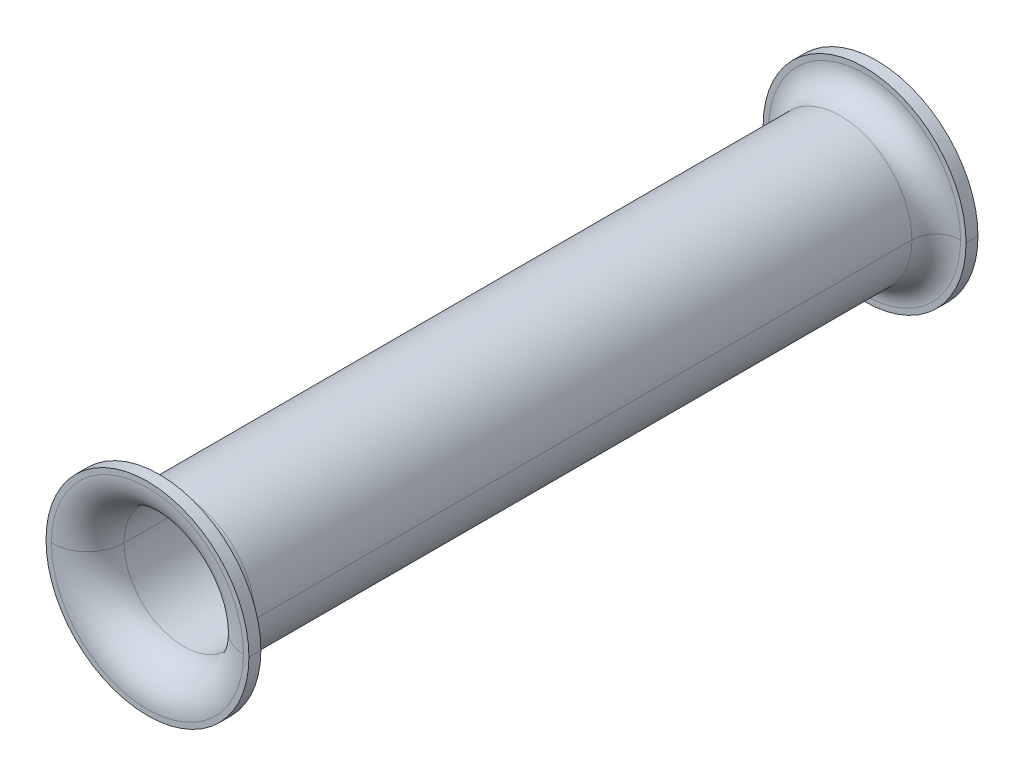
ISO-10303-21;
HEADER;
FILE_DESCRIPTION(('STEP AP214'),'2;1');
FILE_NAME('part.step','',(''),(''),'','','');
FILE_SCHEMA(('AUTOMOTIVE_DESIGN { 1 0 10303 214 1 1 1 1 }'));
ENDSEC;
DATA;
#1=APPLICATION_CONTEXT('core data for automotive mechanical design processes');
#2=APPLICATION_PROTOCOL_DEFINITION('international standard','automotive_design',2000,#1);
#3=PRODUCT_CONTEXT('',#1,'mechanical');
#4=PRODUCT('Part','Part','',(#3));
#5=PRODUCT_RELATED_PRODUCT_CATEGORY('part','',(#4));
#6=PRODUCT_DEFINITION_FORMATION('','',#4);
#7=PRODUCT_DEFINITION_CONTEXT('part definition',#1,'design');
#8=PRODUCT_DEFINITION('design','',#6,#7);
#9=PRODUCT_DEFINITION_SHAPE('','',#8);
#10=(LENGTH_UNIT() NAMED_UNIT(*) SI_UNIT(.MILLI.,.METRE.));
#11=(NAMED_UNIT(*) PLANE_ANGLE_UNIT() SI_UNIT($,.RADIAN.));
#12=(NAMED_UNIT(*) SI_UNIT($,.STERADIAN.) SOLID_ANGLE_UNIT());
#13=UNCERTAINTY_MEASURE_WITH_UNIT(LENGTH_MEASURE(1.E-05),#10,'distance_accuracy_value','');
#14=(GEOMETRIC_REPRESENTATION_CONTEXT(3) GLOBAL_UNCERTAINTY_ASSIGNED_CONTEXT((#13)) GLOBAL_UNIT_ASSIGNED_CONTEXT((#10,
#11,#12)) REPRESENTATION_CONTEXT('',''));
#15=CARTESIAN_POINT('',(0.,0.,0.));
#16=DIRECTION('',(0.,0.,1.));
#17=DIRECTION('',(1.,0.,0.));
#18=AXIS2_PLACEMENT_3D('',#15,#16,#17);
#19=CARTESIAN_POINT('',(0.,0.,-9.07415));
#20=DIRECTION('',(0.,0.,-1.));
#21=DIRECTION('',(-1.,0.,0.));
#22=AXIS2_PLACEMENT_3D('',#19,#20,#21);
#23=TOROIDAL_SURFACE('',#22,2.6543,1.0033);
#24=CARTESIAN_POINT('',(0.,0.,-10.07745));
#25=DIRECTION('',(0.,0.,-1.));
#26=DIRECTION('',(-1.,0.,0.));
#27=AXIS2_PLACEMENT_3D('',#24,#25,#26);
#28=CIRCLE('',#27,2.6543);
#29=CARTESIAN_POINT('',(-2.6543,0.,-10.07745));
#30=VERTEX_POINT('',#29);
#31=CARTESIAN_POINT('',(2.6543,0.,-10.07745));
#32=VERTEX_POINT('',#31);
#33=EDGE_CURVE('E11',#30,#32,#28,.T.);
#34=ORIENTED_EDGE('',*,*,#33,.T.);
#35=CARTESIAN_POINT('',(2.6543,0.,-9.07415));
#36=DIRECTION('',(0.,1.,0.));
#37=DIRECTION('',(-1.,0.,0.));
#38=AXIS2_PLACEMENT_3D('',#35,#36,#37);
#39=CIRCLE('',#38,1.0033);
#40=CARTESIAN_POINT('',(1.651,0.,-9.07415));
#41=VERTEX_POINT('',#40);
#42=EDGE_CURVE('E27',#32,#41,#39,.T.);
#43=ORIENTED_EDGE('',*,*,#42,.T.);
#44=CARTESIAN_POINT('',(0.,0.,-9.07415));
#45=DIRECTION('',(0.,0.,-1.));
#46=DIRECTION('',(-1.,0.,0.));
#47=AXIS2_PLACEMENT_3D('',#44,#45,#46);
#48=CIRCLE('',#47,1.651);
#49=CARTESIAN_POINT('',(-1.651,0.,-9.07415));
#50=VERTEX_POINT('',#49);
#51=EDGE_CURVE('E201',#50,#41,#48,.T.);
#52=ORIENTED_EDGE('',*,*,#51,.F.);
#53=CARTESIAN_POINT('',(-2.6543,0.,-9.07415));
#54=DIRECTION('',(0.,-1.,0.));
#55=DIRECTION('',(0.,0.,-1.));
#56=AXIS2_PLACEMENT_3D('',#53,#54,#55);
#57=CIRCLE('',#56,1.0033);
#58=EDGE_CURVE('E232',#30,#50,#57,.T.);
#59=ORIENTED_EDGE('',*,*,#58,.F.);
#60=EDGE_LOOP('',(#34,#43,#52,#59));
#61=FACE_BOUND('',#60,.T.);
#62=ADVANCED_FACE('F16',(#61),#23,.T.);
#63=CARTESIAN_POINT('',(0.,0.,0.));
#64=DIRECTION('',(0.,0.,-1.));
#65=DIRECTION('',(-1.,0.,0.));
#66=AXIS2_PLACEMENT_3D('',#63,#64,#65);
#67=CYLINDRICAL_SURFACE('',#66,2.805);
#68=CARTESIAN_POINT('',(0.,0.,-9.74725));
#69=DIRECTION('',(0.,0.,-1.));
#70=DIRECTION('',(-1.,0.,0.));
#71=AXIS2_PLACEMENT_3D('',#68,#69,#70);
#72=CIRCLE('',#71,2.805);
#73=CARTESIAN_POINT('',(-2.805,0.,-9.74725));
#74=VERTEX_POINT('',#73);
#75=CARTESIAN_POINT('',(2.805,0.,-9.74725));
#76=VERTEX_POINT('',#75);
#77=EDGE_CURVE('E225',#74,#76,#72,.T.);
#78=ORIENTED_EDGE('',*,*,#77,.T.);
#79=DIRECTION('',(0.,0.,-1.));
#80=VECTOR('',#79,1.);
#81=CARTESIAN_POINT('',(2.805,0.,0.));
#82=LINE('',#81,#80);
#83=CARTESIAN_POINT('',(2.805,0.,-10.07745));
#84=VERTEX_POINT('',#83);
#85=EDGE_CURVE('E207',#76,#84,#82,.T.);
#86=ORIENTED_EDGE('',*,*,#85,.T.);
#87=CARTESIAN_POINT('',(0.,0.,-10.07745));
#88=DIRECTION('',(0.,0.,-1.));
#89=DIRECTION('',(-1.,0.,0.));
#90=AXIS2_PLACEMENT_3D('',#87,#88,#89);
#91=CIRCLE('',#90,2.805);
#92=CARTESIAN_POINT('',(-2.805,0.,-10.07745));
#93=VERTEX_POINT('',#92);
#94=EDGE_CURVE('E183',#93,#84,#91,.T.);
#95=ORIENTED_EDGE('',*,*,#94,.F.);
#96=DIRECTION('',(0.,0.,-1.));
#97=VECTOR('',#96,1.);
#98=CARTESIAN_POINT('',(-2.805,0.,0.));
#99=LINE('',#98,#97);
#100=EDGE_CURVE('E263',#74,#93,#99,.T.);
#101=ORIENTED_EDGE('',*,*,#100,.F.);
#102=EDGE_LOOP('',(#78,#86,#95,#101));
#103=FACE_BOUND('',#102,.T.);
#104=ADVANCED_FACE('F324',(#103),#67,.T.);
#105=CARTESIAN_POINT('',(0.,0.,-9.07415));
#106=DIRECTION('',(0.,0.,-1.));
#107=DIRECTION('',(-1.,0.,0.));
#108=AXIS2_PLACEMENT_3D('',#105,#106,#107);
#109=TOROIDAL_SURFACE('',#108,2.6543,0.6731);
#110=CARTESIAN_POINT('',(0.,0.,-9.74725));
#111=DIRECTION('',(0.,0.,-1.));
#112=DIRECTION('',(-1.,0.,0.));
#113=AXIS2_PLACEMENT_3D('',#110,#111,#112);
#114=CIRCLE('',#113,2.6543);
#115=CARTESIAN_POINT('',(2.6543,0.,-9.74725));
#116=VERTEX_POINT('',#115);
#117=CARTESIAN_POINT('',(-2.6543,0.,-9.74725));
#118=VERTEX_POINT('',#117);
#119=EDGE_CURVE('E190',#116,#118,#114,.T.);
#120=ORIENTED_EDGE('',*,*,#119,.F.);
#121=CARTESIAN_POINT('',(2.6543,0.,-9.07415));
#122=DIRECTION('',(0.,1.,0.));
#123=DIRECTION('',(-1.,0.,0.));
#124=AXIS2_PLACEMENT_3D('',#121,#122,#123);
#125=CIRCLE('',#124,0.6731);
#126=CARTESIAN_POINT('',(1.9812,0.,-9.07415));
#127=VERTEX_POINT('',#126);
#128=EDGE_CURVE('E203',#116,#127,#125,.T.);
#129=ORIENTED_EDGE('',*,*,#128,.T.);
#130=CARTESIAN_POINT('',(0.,0.,-9.07415));
#131=DIRECTION('',(0.,0.,-1.));
#132=DIRECTION('',(-1.,0.,0.));
#133=AXIS2_PLACEMENT_3D('',#130,#131,#132);
#134=CIRCLE('',#133,1.9812);
#135=CARTESIAN_POINT('',(-1.9812,0.,-9.07415));
#136=VERTEX_POINT('',#135);
#137=EDGE_CURVE('E208',#127,#136,#134,.T.);
#138=ORIENTED_EDGE('',*,*,#137,.T.);
#139=CARTESIAN_POINT('',(-2.6543,0.,-9.07415));
#140=DIRECTION('',(0.,-1.,0.));
#141=DIRECTION('',(0.,0.,-1.));
#142=AXIS2_PLACEMENT_3D('',#139,#140,#141);
#143=CIRCLE('',#142,0.6731);
#144=EDGE_CURVE('E245',#118,#136,#143,.T.);
#145=ORIENTED_EDGE('',*,*,#144,.F.);
#146=EDGE_LOOP('',(#120,#129,#138,#145));
#147=FACE_BOUND('',#146,.T.);
#148=ADVANCED_FACE('F329',(#147),#109,.F.);
#149=CARTESIAN_POINT('',(0.,0.,0.));
#150=DIRECTION('',(0.,0.,-1.));
#151=DIRECTION('',(-1.,0.,0.));
#152=AXIS2_PLACEMENT_3D('',#149,#150,#151);
#153=CYLINDRICAL_SURFACE('',#152,1.9812);
#154=CARTESIAN_POINT('',(0.,0.,9.07415));
#155=DIRECTION('',(0.,0.,-1.));
#156=DIRECTION('',(-1.,0.,0.));
#157=AXIS2_PLACEMENT_3D('',#154,#155,#156);
#158=CIRCLE('',#157,1.9812);
#159=CARTESIAN_POINT('',(-1.9812,0.,9.07415));
#160=VERTEX_POINT('',#159);
#161=CARTESIAN_POINT('',(1.9812,0.,9.07415));
#162=VERTEX_POINT('',#161);
#163=EDGE_CURVE('E151',#160,#162,#158,.T.);
#164=ORIENTED_EDGE('',*,*,#163,.T.);
#165=DIRECTION('',(0.,0.,-1.));
#166=VECTOR('',#165,1.);
#167=CARTESIAN_POINT('',(1.9812,0.,0.));
#168=LINE('',#167,#166);
#169=EDGE_CURVE('E231',#162,#127,#168,.T.);
#170=ORIENTED_EDGE('',*,*,#169,.T.);
#171=CARTESIAN_POINT('',(0.,0.,-9.07415));
#172=DIRECTION('',(0.,0.,-1.));
#173=DIRECTION('',(-1.,0.,0.));
#174=AXIS2_PLACEMENT_3D('',#171,#172,#173);
#175=CIRCLE('',#174,1.9812);
#176=EDGE_CURVE('E267',#136,#127,#175,.T.);
#177=ORIENTED_EDGE('',*,*,#176,.F.);
#178=DIRECTION('',(0.,0.,-1.));
#179=VECTOR('',#178,1.);
#180=CARTESIAN_POINT('',(-1.9812,0.,0.));
#181=LINE('',#180,#179);
#182=EDGE_CURVE('E174',#160,#136,#181,.T.);
#183=ORIENTED_EDGE('',*,*,#182,.F.);
#184=EDGE_LOOP('',(#164,#170,#177,#183));
#185=FACE_BOUND('',#184,.T.);
#186=ADVANCED_FACE('F356',(#185),#153,.T.);
#187=CARTESIAN_POINT('',(0.,0.,9.07415));
#188=DIRECTION('',(0.,0.,-1.));
#189=DIRECTION('',(-1.,0.,0.));
#190=AXIS2_PLACEMENT_3D('',#187,#188,#189);
#191=TOROIDAL_SURFACE('',#190,2.6543,0.6731);
#192=CARTESIAN_POINT('',(0.,0.,9.07415));
#193=DIRECTION('',(0.,0.,-1.));
#194=DIRECTION('',(-1.,0.,0.));
#195=AXIS2_PLACEMENT_3D('',#192,#193,#194);
#196=CIRCLE('',#195,1.9812);
#197=EDGE_CURVE('E166',#162,#160,#196,.T.);
#198=ORIENTED_EDGE('',*,*,#197,.F.);
#199=CARTESIAN_POINT('',(2.6543,0.,9.07415));
#200=DIRECTION('',(0.,1.,0.));
#201=DIRECTION('',(-1.,0.,0.));
#202=AXIS2_PLACEMENT_3D('',#199,#200,#201);
#203=CIRCLE('',#202,0.6731);
#204=CARTESIAN_POINT('',(2.6543,0.,9.74725));
#205=VERTEX_POINT('',#204);
#206=EDGE_CURVE('E159',#162,#205,#203,.T.);
#207=ORIENTED_EDGE('',*,*,#206,.T.);
#208=CARTESIAN_POINT('',(0.,0.,9.74725));
#209=DIRECTION('',(0.,0.,-1.));
#210=DIRECTION('',(-1.,0.,0.));
#211=AXIS2_PLACEMENT_3D('',#208,#209,#210);
#212=CIRCLE('',#211,2.6543);
#213=CARTESIAN_POINT('',(-2.6543,0.,9.74725));
#214=VERTEX_POINT('',#213);
#215=EDGE_CURVE('E157',#205,#214,#212,.T.);
#216=ORIENTED_EDGE('',*,*,#215,.T.);
#217=CARTESIAN_POINT('',(-2.6543,0.,9.07415));
#218=DIRECTION('',(0.,-1.,0.));
#219=DIRECTION('',(0.,0.,-1.));
#220=AXIS2_PLACEMENT_3D('',#217,#218,#219);
#221=CIRCLE('',#220,0.6731);
#222=EDGE_CURVE('E145',#160,#214,#221,.T.);
#223=ORIENTED_EDGE('',*,*,#222,.F.);
#224=EDGE_LOOP('',(#198,#207,#216,#223));
#225=FACE_BOUND('',#224,.T.);
#226=ADVANCED_FACE('F158',(#225),#191,.F.);
#227=CARTESIAN_POINT('',(0.,0.,0.));
#228=DIRECTION('',(0.,0.,-1.));
#229=DIRECTION('',(-1.,0.,0.));
#230=AXIS2_PLACEMENT_3D('',#227,#228,#229);
#231=CYLINDRICAL_SURFACE('',#230,2.805);
#232=CARTESIAN_POINT('',(0.,0.,10.07745));
#233=DIRECTION('',(0.,0.,-1.));
#234=DIRECTION('',(-1.,0.,0.));
#235=AXIS2_PLACEMENT_3D('',#232,#233,#234);
#236=CIRCLE('',#235,2.805);
#237=CARTESIAN_POINT('',(-2.805,0.,10.07745));
#238=VERTEX_POINT('',#237);
#239=CARTESIAN_POINT('',(2.805,0.,10.07745));
#240=VERTEX_POINT('',#239);
#241=EDGE_CURVE('E162',#238,#240,#236,.T.);
#242=ORIENTED_EDGE('',*,*,#241,.T.);
#243=DIRECTION('',(0.,0.,-1.));
#244=VECTOR('',#243,1.);
#245=CARTESIAN_POINT('',(2.805,0.,0.));
#246=LINE('',#245,#244);
#247=CARTESIAN_POINT('',(2.805,0.,9.74725));
#248=VERTEX_POINT('',#247);
#249=EDGE_CURVE('E194',#240,#248,#246,.T.);
#250=ORIENTED_EDGE('',*,*,#249,.T.);
#251=CARTESIAN_POINT('',(0.,0.,9.74725));
#252=DIRECTION('',(0.,0.,-1.));
#253=DIRECTION('',(-1.,0.,0.));
#254=AXIS2_PLACEMENT_3D('',#251,#252,#253);
#255=CIRCLE('',#254,2.805);
#256=CARTESIAN_POINT('',(-2.805,0.,9.74725));
#257=VERTEX_POINT('',#256);
#258=EDGE_CURVE('E251',#257,#248,#255,.T.);
#259=ORIENTED_EDGE('',*,*,#258,.F.);
#260=DIRECTION('',(0.,0.,-1.));
#261=VECTOR('',#260,1.);
#262=CARTESIAN_POINT('',(-2.805,0.,0.));
#263=LINE('',#262,#261);
#264=EDGE_CURVE('E109',#238,#257,#263,.T.);
#265=ORIENTED_EDGE('',*,*,#264,.F.);
#266=EDGE_LOOP('',(#242,#250,#259,#265));
#267=FACE_BOUND('',#266,.T.);
#268=ADVANCED_FACE('F333',(#267),#231,.T.);
#269=CARTESIAN_POINT('',(0.,0.,9.07415));
#270=DIRECTION('',(0.,0.,-1.));
#271=DIRECTION('',(-1.,0.,0.));
#272=AXIS2_PLACEMENT_3D('',#269,#270,#271);
#273=TOROIDAL_SURFACE('',#272,2.6543,1.0033);
#274=CARTESIAN_POINT('',(0.,0.,9.07415));
#275=DIRECTION('',(0.,0.,-1.));
#276=DIRECTION('',(-1.,0.,0.));
#277=AXIS2_PLACEMENT_3D('',#274,#275,#276);
#278=CIRCLE('',#277,1.651);
#279=CARTESIAN_POINT('',(-1.651,0.,9.07415));
#280=VERTEX_POINT('',#279);
#281=CARTESIAN_POINT('',(1.651,0.,9.07415));
#282=VERTEX_POINT('',#281);
#283=EDGE_CURVE('E198',#280,#282,#278,.T.);
#284=ORIENTED_EDGE('',*,*,#283,.T.);
#285=CARTESIAN_POINT('',(2.6543,0.,9.07415));
#286=DIRECTION('',(0.,1.,0.));
#287=DIRECTION('',(-1.,0.,0.));
#288=AXIS2_PLACEMENT_3D('',#285,#286,#287);
#289=CIRCLE('',#288,1.0033);
#290=CARTESIAN_POINT('',(2.6543,0.,10.07745));
#291=VERTEX_POINT('',#290);
#292=EDGE_CURVE('E209',#282,#291,#289,.T.);
#293=ORIENTED_EDGE('',*,*,#292,.T.);
#294=CARTESIAN_POINT('',(0.,0.,10.07745));
#295=DIRECTION('',(0.,0.,-1.));
#296=DIRECTION('',(-1.,0.,0.));
#297=AXIS2_PLACEMENT_3D('',#294,#295,#296);
#298=CIRCLE('',#297,2.6543);
#299=CARTESIAN_POINT('',(-2.6543,0.,10.07745));
#300=VERTEX_POINT('',#299);
#301=EDGE_CURVE('E20',#300,#291,#298,.T.);
#302=ORIENTED_EDGE('',*,*,#301,.F.);
#303=CARTESIAN_POINT('',(-2.6543,0.,9.07415));
#304=DIRECTION('',(0.,-1.,0.));
#305=DIRECTION('',(0.,0.,-1.));
#306=AXIS2_PLACEMENT_3D('',#303,#304,#305);
#307=CIRCLE('',#306,1.0033);
#308=EDGE_CURVE('E202',#280,#300,#307,.T.);
#309=ORIENTED_EDGE('',*,*,#308,.F.);
#310=EDGE_LOOP('',(#284,#293,#302,#309));
#311=FACE_BOUND('',#310,.T.);
#312=ADVANCED_FACE('F336',(#311),#273,.T.);
#313=CARTESIAN_POINT('',(0.,0.,0.));
#314=DIRECTION('',(0.,0.,-1.));
#315=DIRECTION('',(-1.,0.,0.));
#316=AXIS2_PLACEMENT_3D('',#313,#314,#315);
#317=CYLINDRICAL_SURFACE('',#316,1.651);
#318=CARTESIAN_POINT('',(0.,0.,9.07415));
#319=DIRECTION('',(0.,0.,-1.));
#320=DIRECTION('',(-1.,0.,0.));
#321=AXIS2_PLACEMENT_3D('',#318,#319,#320);
#322=CIRCLE('',#321,1.651);
#323=EDGE_CURVE('E96',#282,#280,#322,.T.);
#324=ORIENTED_EDGE('',*,*,#323,.F.);
#325=DIRECTION('',(0.,0.,-1.));
#326=VECTOR('',#325,1.);
#327=CARTESIAN_POINT('',(1.651,0.,0.));
#328=LINE('',#327,#326);
#329=EDGE_CURVE('E213',#282,#41,#328,.T.);
#330=ORIENTED_EDGE('',*,*,#329,.T.);
#331=CARTESIAN_POINT('',(0.,0.,-9.07415));
#332=DIRECTION('',(0.,0.,-1.));
#333=DIRECTION('',(-1.,0.,0.));
#334=AXIS2_PLACEMENT_3D('',#331,#332,#333);
#335=CIRCLE('',#334,1.651);
#336=EDGE_CURVE('E256',#41,#50,#335,.T.);
#337=ORIENTED_EDGE('',*,*,#336,.T.);
#338=DIRECTION('',(0.,0.,-1.));
#339=VECTOR('',#338,1.);
#340=CARTESIAN_POINT('',(-1.651,0.,0.));
#341=LINE('',#340,#339);
#342=EDGE_CURVE('E228',#280,#50,#341,.T.);
#343=ORIENTED_EDGE('',*,*,#342,.F.);
#344=EDGE_LOOP('',(#324,#330,#337,#343));
#345=FACE_BOUND('',#344,.T.);
#346=ADVANCED_FACE('F301',(#345),#317,.F.);
#347=CARTESIAN_POINT('',(0.,0.,0.));
#348=DIRECTION('',(0.,0.,-1.));
#349=DIRECTION('',(-1.,0.,0.));
#350=AXIS2_PLACEMENT_3D('',#347,#348,#349);
#351=CYLINDRICAL_SURFACE('',#350,1.651);
#352=ORIENTED_EDGE('',*,*,#329,.F.);
#353=ORIENTED_EDGE('',*,*,#283,.F.);
#354=ORIENTED_EDGE('',*,*,#342,.T.);
#355=ORIENTED_EDGE('',*,*,#51,.T.);
#356=EDGE_LOOP('',(#352,#353,#354,#355));
#357=FACE_BOUND('',#356,.T.);
#358=ADVANCED_FACE('F299',(#357),#351,.F.);
#359=CARTESIAN_POINT('',(0.,0.,9.07415));
#360=DIRECTION('',(0.,0.,-1.));
#361=DIRECTION('',(-1.,0.,0.));
#362=AXIS2_PLACEMENT_3D('',#359,#360,#361);
#363=TOROIDAL_SURFACE('',#362,2.6543,1.0033);
#364=ORIENTED_EDGE('',*,*,#292,.F.);
#365=ORIENTED_EDGE('',*,*,#323,.T.);
#366=ORIENTED_EDGE('',*,*,#308,.T.);
#367=CARTESIAN_POINT('',(0.,0.,10.07745));
#368=DIRECTION('',(0.,0.,-1.));
#369=DIRECTION('',(-1.,0.,0.));
#370=AXIS2_PLACEMENT_3D('',#367,#368,#369);
#371=CIRCLE('',#370,2.6543);
#372=EDGE_CURVE('E185',#291,#300,#371,.T.);
#373=ORIENTED_EDGE('',*,*,#372,.F.);
#374=EDGE_LOOP('',(#364,#365,#366,#373));
#375=FACE_BOUND('',#374,.T.);
#376=ADVANCED_FACE('F350',(#375),#363,.T.);
#377=CARTESIAN_POINT('',(0.,0.,10.07745));
#378=DIRECTION('',(0.,0.,-1.));
#379=DIRECTION('',(0.,-1.,0.));
#380=AXIS2_PLACEMENT_3D('',#377,#378,#379);
#381=PLANE('',#380);
#382=ORIENTED_EDGE('',*,*,#241,.F.);
#383=CARTESIAN_POINT('',(0.,0.,10.07745));
#384=DIRECTION('',(0.,0.,-1.));
#385=DIRECTION('',(-1.,0.,0.));
#386=AXIS2_PLACEMENT_3D('',#383,#384,#385);
#387=CIRCLE('',#386,2.805);
#388=EDGE_CURVE('E189',#240,#238,#387,.T.);
#389=ORIENTED_EDGE('',*,*,#388,.F.);
#390=EDGE_LOOP('',(#382,#389));
#391=FACE_BOUND('',#390,.T.);
#392=ORIENTED_EDGE('',*,*,#301,.T.);
#393=ORIENTED_EDGE('',*,*,#372,.T.);
#394=EDGE_LOOP('',(#392,#393));
#395=FACE_BOUND('',#394,.T.);
#396=ADVANCED_FACE('F348',(#391,#395),#381,.F.);
#397=CARTESIAN_POINT('',(0.,0.,0.));
#398=DIRECTION('',(0.,0.,-1.));
#399=DIRECTION('',(-1.,0.,0.));
#400=AXIS2_PLACEMENT_3D('',#397,#398,#399);
#401=CYLINDRICAL_SURFACE('',#400,2.805);
#402=ORIENTED_EDGE('',*,*,#249,.F.);
#403=ORIENTED_EDGE('',*,*,#388,.T.);
#404=ORIENTED_EDGE('',*,*,#264,.T.);
#405=CARTESIAN_POINT('',(0.,0.,9.74725));
#406=DIRECTION('',(0.,0.,-1.));
#407=DIRECTION('',(-1.,0.,0.));
#408=AXIS2_PLACEMENT_3D('',#405,#406,#407);
#409=CIRCLE('',#408,2.805);
#410=EDGE_CURVE('E154',#248,#257,#409,.T.);
#411=ORIENTED_EDGE('',*,*,#410,.F.);
#412=EDGE_LOOP('',(#402,#403,#404,#411));
#413=FACE_BOUND('',#412,.T.);
#414=ADVANCED_FACE('F346',(#413),#401,.T.);
#415=CARTESIAN_POINT('',(0.,0.,9.74725));
#416=DIRECTION('',(0.,0.,1.));
#417=DIRECTION('',(1.,0.,0.));
#418=AXIS2_PLACEMENT_3D('',#415,#416,#417);
#419=PLANE('',#418);
#420=ORIENTED_EDGE('',*,*,#258,.T.);
#421=ORIENTED_EDGE('',*,*,#410,.T.);
#422=EDGE_LOOP('',(#420,#421));
#423=FACE_BOUND('',#422,.T.);
#424=CARTESIAN_POINT('',(0.,0.,9.74725));
#425=DIRECTION('',(0.,0.,-1.));
#426=DIRECTION('',(-1.,0.,0.));
#427=AXIS2_PLACEMENT_3D('',#424,#425,#426);
#428=CIRCLE('',#427,2.6543);
#429=EDGE_CURVE('E149',#214,#205,#428,.T.);
#430=ORIENTED_EDGE('',*,*,#429,.F.);
#431=ORIENTED_EDGE('',*,*,#215,.F.);
#432=EDGE_LOOP('',(#430,#431));
#433=FACE_BOUND('',#432,.T.);
#434=ADVANCED_FACE('F164',(#423,#433),#419,.F.);
#435=CARTESIAN_POINT('',(0.,0.,9.07415));
#436=DIRECTION('',(0.,0.,-1.));
#437=DIRECTION('',(-1.,0.,0.));
#438=AXIS2_PLACEMENT_3D('',#435,#436,#437);
#439=TOROIDAL_SURFACE('',#438,2.6543,0.6731);
#440=ORIENTED_EDGE('',*,*,#206,.F.);
#441=ORIENTED_EDGE('',*,*,#163,.F.);
#442=ORIENTED_EDGE('',*,*,#222,.T.);
#443=ORIENTED_EDGE('',*,*,#429,.T.);
#444=EDGE_LOOP('',(#440,#441,#442,#443));
#445=FACE_BOUND('',#444,.T.);
#446=ADVANCED_FACE('F18',(#445),#439,.F.);
#447=CARTESIAN_POINT('',(0.,0.,0.));
#448=DIRECTION('',(0.,0.,-1.));
#449=DIRECTION('',(-1.,0.,0.));
#450=AXIS2_PLACEMENT_3D('',#447,#448,#449);
#451=CYLINDRICAL_SURFACE('',#450,1.9812);
#452=ORIENTED_EDGE('',*,*,#169,.F.);
#453=ORIENTED_EDGE('',*,*,#197,.T.);
#454=ORIENTED_EDGE('',*,*,#182,.T.);
#455=ORIENTED_EDGE('',*,*,#137,.F.);
#456=EDGE_LOOP('',(#452,#453,#454,#455));
#457=FACE_BOUND('',#456,.T.);
#458=ADVANCED_FACE('F360',(#457),#451,.T.);
#459=CARTESIAN_POINT('',(0.,0.,-9.07415));
#460=DIRECTION('',(0.,0.,-1.));
#461=DIRECTION('',(-1.,0.,0.));
#462=AXIS2_PLACEMENT_3D('',#459,#460,#461);
#463=TOROIDAL_SURFACE('',#462,2.6543,0.6731);
#464=ORIENTED_EDGE('',*,*,#128,.F.);
#465=CARTESIAN_POINT('',(0.,0.,-9.74725));
#466=DIRECTION('',(0.,0.,-1.));
#467=DIRECTION('',(-1.,0.,0.));
#468=AXIS2_PLACEMENT_3D('',#465,#466,#467);
#469=CIRCLE('',#468,2.6543);
#470=EDGE_CURVE('E178',#118,#116,#469,.T.);
#471=ORIENTED_EDGE('',*,*,#470,.F.);
#472=ORIENTED_EDGE('',*,*,#144,.T.);
#473=ORIENTED_EDGE('',*,*,#176,.T.);
#474=EDGE_LOOP('',(#464,#471,#472,#473));
#475=FACE_BOUND('',#474,.T.);
#476=ADVANCED_FACE('F344',(#475),#463,.F.);
#477=CARTESIAN_POINT('',(0.,0.,-9.74725));
#478=DIRECTION('',(0.,0.,1.));
#479=DIRECTION('',(1.,0.,0.));
#480=AXIS2_PLACEMENT_3D('',#477,#478,#479);
#481=PLANE('',#480);
#482=ORIENTED_EDGE('',*,*,#77,.F.);
#483=CARTESIAN_POINT('',(0.,0.,-9.74725));
#484=DIRECTION('',(0.,0.,-1.));
#485=DIRECTION('',(-1.,0.,0.));
#486=AXIS2_PLACEMENT_3D('',#483,#484,#485);
#487=CIRCLE('',#486,2.805);
#488=EDGE_CURVE('E192',#76,#74,#487,.T.);
#489=ORIENTED_EDGE('',*,*,#488,.F.);
#490=EDGE_LOOP('',(#482,#489));
#491=FACE_BOUND('',#490,.T.);
#492=ORIENTED_EDGE('',*,*,#470,.T.);
#493=ORIENTED_EDGE('',*,*,#119,.T.);
#494=EDGE_LOOP('',(#492,#493));
#495=FACE_BOUND('',#494,.T.);
#496=ADVANCED_FACE('F318',(#491,#495),#481,.T.);
#497=CARTESIAN_POINT('',(0.,0.,0.));
#498=DIRECTION('',(0.,0.,-1.));
#499=DIRECTION('',(-1.,0.,0.));
#500=AXIS2_PLACEMENT_3D('',#497,#498,#499);
#501=CYLINDRICAL_SURFACE('',#500,2.805);
#502=ORIENTED_EDGE('',*,*,#85,.F.);
#503=ORIENTED_EDGE('',*,*,#488,.T.);
#504=ORIENTED_EDGE('',*,*,#100,.T.);
#505=CARTESIAN_POINT('',(0.,0.,-10.07745));
#506=DIRECTION('',(0.,0.,-1.));
#507=DIRECTION('',(-1.,0.,0.));
#508=AXIS2_PLACEMENT_3D('',#505,#506,#507);
#509=CIRCLE('',#508,2.805);
#510=EDGE_CURVE('E180',#84,#93,#509,.T.);
#511=ORIENTED_EDGE('',*,*,#510,.F.);
#512=EDGE_LOOP('',(#502,#503,#504,#511));
#513=FACE_BOUND('',#512,.T.);
#514=ADVANCED_FACE('F309',(#513),#501,.T.);
#515=CARTESIAN_POINT('',(0.,0.,-10.07745));
#516=DIRECTION('',(0.,0.,-1.));
#517=DIRECTION('',(0.,-1.,0.));
#518=AXIS2_PLACEMENT_3D('',#515,#516,#517);
#519=PLANE('',#518);
#520=ORIENTED_EDGE('',*,*,#94,.T.);
#521=ORIENTED_EDGE('',*,*,#510,.T.);
#522=EDGE_LOOP('',(#520,#521));
#523=FACE_BOUND('',#522,.T.);
#524=ORIENTED_EDGE('',*,*,#33,.F.);
#525=CARTESIAN_POINT('',(0.,0.,-10.07745));
#526=DIRECTION('',(0.,0.,-1.));
#527=DIRECTION('',(-1.,0.,0.));
#528=AXIS2_PLACEMENT_3D('',#525,#526,#527);
#529=CIRCLE('',#528,2.6543);
#530=EDGE_CURVE('E184',#32,#30,#529,.T.);
#531=ORIENTED_EDGE('',*,*,#530,.F.);
#532=EDGE_LOOP('',(#524,#531));
#533=FACE_BOUND('',#532,.T.);
#534=ADVANCED_FACE('F307',(#523,#533),#519,.T.);
#535=CARTESIAN_POINT('',(0.,0.,-9.07415));
#536=DIRECTION('',(0.,0.,-1.));
#537=DIRECTION('',(-1.,0.,0.));
#538=AXIS2_PLACEMENT_3D('',#535,#536,#537);
#539=TOROIDAL_SURFACE('',#538,2.6543,1.0033);
#540=ORIENTED_EDGE('',*,*,#42,.F.);
#541=ORIENTED_EDGE('',*,*,#530,.T.);
#542=ORIENTED_EDGE('',*,*,#58,.T.);
#543=ORIENTED_EDGE('',*,*,#336,.F.);
#544=EDGE_LOOP('',(#540,#541,#542,#543));
#545=FACE_BOUND('',#544,.T.);
#546=ADVANCED_FACE('F302',(#545),#539,.T.);
#547=CLOSED_SHELL('',(#62,#104,#148,#186,#226,#268,#312,#346,#358,#376,#396,#414,#434,#446,#458,
#476,#496,#514,#534,#546));
#548=MANIFOLD_SOLID_BREP('B1',#547);
#549=ADVANCED_BREP_SHAPE_REPRESENTATION('',(#18,#548),#14);
#550=SHAPE_DEFINITION_REPRESENTATION(#9,#549);
ENDSEC;
END-ISO-10303-21;
